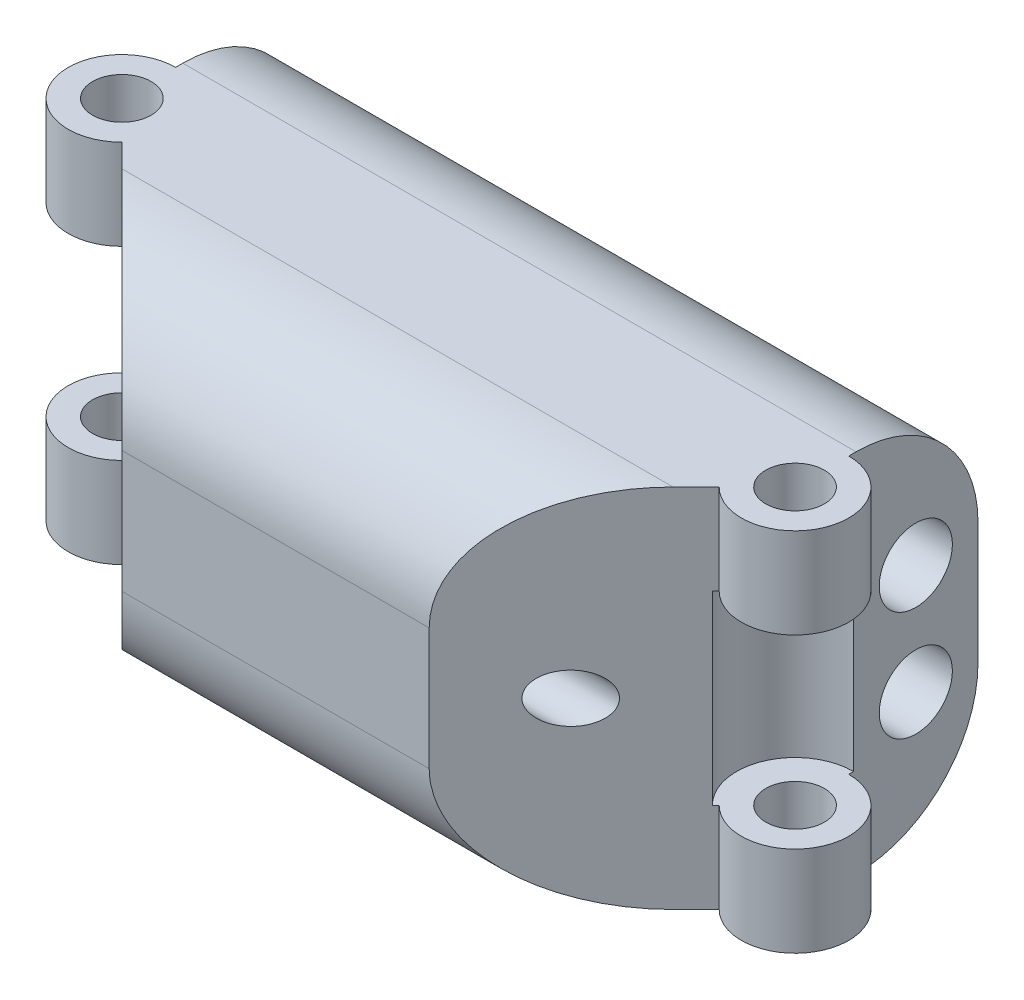
ISO-10303-21;
HEADER;
FILE_DESCRIPTION(('STEP AP214'),'2;1');
FILE_NAME('part.step','',(''),(''),'','','');
FILE_SCHEMA(('AUTOMOTIVE_DESIGN { 1 0 10303 214 1 1 1 1 }'));
ENDSEC;
DATA;
#1=APPLICATION_CONTEXT('core data for automotive mechanical design processes');
#2=APPLICATION_PROTOCOL_DEFINITION('international standard','automotive_design',2000,#1);
#3=PRODUCT_CONTEXT('',#1,'mechanical');
#4=PRODUCT('Part','Part','',(#3));
#5=PRODUCT_RELATED_PRODUCT_CATEGORY('part','',(#4));
#6=PRODUCT_DEFINITION_FORMATION('','',#4);
#7=PRODUCT_DEFINITION_CONTEXT('part definition',#1,'design');
#8=PRODUCT_DEFINITION('design','',#6,#7);
#9=PRODUCT_DEFINITION_SHAPE('','',#8);
#10=(LENGTH_UNIT() NAMED_UNIT(*) SI_UNIT(.MILLI.,.METRE.));
#11=(NAMED_UNIT(*) PLANE_ANGLE_UNIT() SI_UNIT($,.RADIAN.));
#12=(NAMED_UNIT(*) SI_UNIT($,.STERADIAN.) SOLID_ANGLE_UNIT());
#13=UNCERTAINTY_MEASURE_WITH_UNIT(LENGTH_MEASURE(1.E-05),#10,'distance_accuracy_value','');
#14=(GEOMETRIC_REPRESENTATION_CONTEXT(3) GLOBAL_UNCERTAINTY_ASSIGNED_CONTEXT((#13)) GLOBAL_UNIT_ASSIGNED_CONTEXT((#10,
#11,#12)) REPRESENTATION_CONTEXT('',''));
#15=CARTESIAN_POINT('',(0.,0.,0.));
#16=DIRECTION('',(0.,0.,1.));
#17=DIRECTION('',(1.,0.,0.));
#18=AXIS2_PLACEMENT_3D('',#15,#16,#17);
#19=CARTESIAN_POINT('',(-13.8,-7.5,0.));
#20=DIRECTION('',(0.,1.,0.));
#21=DIRECTION('',(0.,0.,1.));
#22=AXIS2_PLACEMENT_3D('',#19,#20,#21);
#23=CYLINDRICAL_SURFACE('',#22,2.4);
#24=CARTESIAN_POINT('',(-13.8,-3.8,0.));
#25=DIRECTION('',(0.,1.,0.));
#26=DIRECTION('',(0.,0.,-1.));
#27=AXIS2_PLACEMENT_3D('',#24,#25,#26);
#28=CIRCLE('',#27,2.4);
#29=CARTESIAN_POINT('',(-12.1029437251523,-3.8,1.69705627484772));
#30=VERTEX_POINT('',#29);
#31=CARTESIAN_POINT('',(-13.8,-3.8,-2.39999999999999));
#32=VERTEX_POINT('',#31);
#33=EDGE_CURVE('E226',#30,#32,#28,.T.);
#34=ORIENTED_EDGE('',*,*,#33,.F.);
#35=DIRECTION('',(0.,1.,0.));
#36=VECTOR('',#35,1.);
#37=CARTESIAN_POINT('',(-12.1029437251523,-7.5,1.69705627484771));
#38=LINE('',#37,#36);
#39=CARTESIAN_POINT('',(-12.1029437251523,3.8,1.69705627484771));
#40=VERTEX_POINT('',#39);
#41=EDGE_CURVE('E71',#30,#40,#38,.T.);
#42=ORIENTED_EDGE('',*,*,#41,.T.);
#43=CARTESIAN_POINT('',(-13.8,3.8,0.));
#44=DIRECTION('',(0.,1.,0.));
#45=DIRECTION('',(0.,0.,-1.));
#46=AXIS2_PLACEMENT_3D('',#43,#44,#45);
#47=CIRCLE('',#46,2.4);
#48=CARTESIAN_POINT('',(-13.8,3.8,-2.4));
#49=VERTEX_POINT('',#48);
#50=EDGE_CURVE('E276',#40,#49,#47,.T.);
#51=ORIENTED_EDGE('',*,*,#50,.T.);
#52=DIRECTION('',(0.,1.,0.));
#53=VECTOR('',#52,1.);
#54=CARTESIAN_POINT('',(-13.8,-7.5,-2.4));
#55=LINE('',#54,#53);
#56=EDGE_CURVE('E395',#32,#49,#55,.T.);
#57=ORIENTED_EDGE('',*,*,#56,.F.);
#58=EDGE_LOOP('',(#34,#42,#51,#57));
#59=FACE_BOUND('',#58,.T.);
#60=ADVANCED_FACE('F47',(#59),#23,.F.);
#61=CARTESIAN_POINT('',(13.8,-7.5,0.));
#62=DIRECTION('',(0.,1.,0.));
#63=DIRECTION('',(0.,0.,1.));
#64=AXIS2_PLACEMENT_3D('',#61,#62,#63);
#65=CYLINDRICAL_SURFACE('',#64,2.4);
#66=DIRECTION('',(0.,1.,0.));
#67=VECTOR('',#66,1.);
#68=CARTESIAN_POINT('',(12.1029437251523,-7.5,1.69705627484771));
#69=LINE('',#68,#67);
#70=CARTESIAN_POINT('',(12.1029437251523,-3.8,1.69705627484771));
#71=VERTEX_POINT('',#70);
#72=CARTESIAN_POINT('',(12.1029437251523,3.8,1.69705627484771));
#73=VERTEX_POINT('',#72);
#74=EDGE_CURVE('E63',#71,#73,#69,.T.);
#75=ORIENTED_EDGE('',*,*,#74,.F.);
#76=CARTESIAN_POINT('',(13.8,-3.8,0.));
#77=DIRECTION('',(0.,1.,0.));
#78=DIRECTION('',(0.,0.,1.));
#79=AXIS2_PLACEMENT_3D('',#76,#77,#78);
#80=CIRCLE('',#79,2.4);
#81=CARTESIAN_POINT('',(13.8,-3.8,-2.4));
#82=VERTEX_POINT('',#81);
#83=EDGE_CURVE('E243',#82,#71,#80,.T.);
#84=ORIENTED_EDGE('',*,*,#83,.F.);
#85=DIRECTION('',(0.,1.,0.));
#86=VECTOR('',#85,1.);
#87=CARTESIAN_POINT('',(13.8,-7.5,-2.4));
#88=LINE('',#87,#86);
#89=CARTESIAN_POINT('',(13.8,3.8,-2.4));
#90=VERTEX_POINT('',#89);
#91=EDGE_CURVE('E381',#82,#90,#88,.T.);
#92=ORIENTED_EDGE('',*,*,#91,.T.);
#93=CARTESIAN_POINT('',(13.8,3.8,0.));
#94=DIRECTION('',(0.,1.,0.));
#95=DIRECTION('',(0.,0.,1.));
#96=AXIS2_PLACEMENT_3D('',#93,#94,#95);
#97=CIRCLE('',#96,2.4);
#98=EDGE_CURVE('E324',#90,#73,#97,.T.);
#99=ORIENTED_EDGE('',*,*,#98,.T.);
#100=EDGE_LOOP('',(#75,#84,#92,#99));
#101=FACE_BOUND('',#100,.T.);
#102=ADVANCED_FACE('F500',(#101),#65,.F.);
#103=CARTESIAN_POINT('',(6.9,-7.5,6.9));
#104=DIRECTION('',(-0.707106781186547,0.,-0.707106781186548));
#105=DIRECTION('',(-0.707106781186548,0.,0.707106781186547));
#106=AXIS2_PLACEMENT_3D('',#103,#104,#105);
#107=PLANE('',#106);
#108=CARTESIAN_POINT('',(9.20147186257615,0.,4.59852813742385));
#109=DIRECTION('',(-0.707106781186547,0.,-0.707106781186548));
#110=DIRECTION('',(-0.707106781186548,0.,0.707106781186547));
#111=AXIS2_PLACEMENT_3D('',#108,#109,#110);
#112=ELLIPSE('',#111,1.4142135623731,1.);
#113=CARTESIAN_POINT('',(8.20147186257614,0.,5.59852813742385));
#114=VERTEX_POINT('',#113);
#115=EDGE_CURVE('E340',#114,#114,#112,.T.);
#116=ORIENTED_EDGE('',*,*,#115,.T.);
#117=EDGE_LOOP('',(#116));
#118=FACE_BOUND('',#117,.T.);
#119=DIRECTION('',(-0.707106781186548,0.,0.707106781186547));
#120=VECTOR('',#119,1.);
#121=CARTESIAN_POINT('',(6.9,7.5,6.9));
#122=LINE('',#121,#120);
#123=CARTESIAN_POINT('',(12.2443650813896,7.5,1.5556349186104));
#124=VERTEX_POINT('',#123);
#125=CARTESIAN_POINT('',(11.3,7.5,2.5));
#126=VERTEX_POINT('',#125);
#127=EDGE_CURVE('E370',#124,#126,#122,.T.);
#128=ORIENTED_EDGE('',*,*,#127,.T.);
#129=CARTESIAN_POINT('',(11.3,2.5,2.5));
#130=DIRECTION('',(-0.707106781186547,0.,-0.707106781186548));
#131=DIRECTION('',(0.707106781186548,0.,-0.707106781186547));
#132=AXIS2_PLACEMENT_3D('',#129,#130,#131);
#133=ELLIPSE('',#132,7.07106781186548,5.);
#134=CARTESIAN_POINT('',(6.3,2.5,7.5));
#135=VERTEX_POINT('',#134);
#136=EDGE_CURVE('E56',#126,#135,#133,.F.);
#137=ORIENTED_EDGE('',*,*,#136,.T.);
#138=DIRECTION('',(0.,1.,0.));
#139=VECTOR('',#138,1.);
#140=CARTESIAN_POINT('',(6.3,-7.5,7.5));
#141=LINE('',#140,#139);
#142=CARTESIAN_POINT('',(6.3,-2.5,7.5));
#143=VERTEX_POINT('',#142);
#144=EDGE_CURVE('E385',#143,#135,#141,.T.);
#145=ORIENTED_EDGE('',*,*,#144,.F.);
#146=CARTESIAN_POINT('',(11.3,-2.5,2.5));
#147=DIRECTION('',(-0.707106781186547,0.,-0.707106781186548));
#148=DIRECTION('',(-0.707106781186548,0.,0.707106781186547));
#149=AXIS2_PLACEMENT_3D('',#146,#147,#148);
#150=ELLIPSE('',#149,7.07106781186548,5.);
#151=CARTESIAN_POINT('',(11.3,-7.5,2.5));
#152=VERTEX_POINT('',#151);
#153=EDGE_CURVE('E447',#143,#152,#150,.F.);
#154=ORIENTED_EDGE('',*,*,#153,.T.);
#155=DIRECTION('',(-0.707106781186548,0.,0.707106781186547));
#156=VECTOR('',#155,1.);
#157=CARTESIAN_POINT('',(6.9,-7.5,6.9));
#158=LINE('',#157,#156);
#159=CARTESIAN_POINT('',(12.2443650813896,-7.5,1.5556349186104));
#160=VERTEX_POINT('',#159);
#161=EDGE_CURVE('E378',#160,#152,#158,.T.);
#162=ORIENTED_EDGE('',*,*,#161,.F.);
#163=DIRECTION('',(0.,1.,0.));
#164=VECTOR('',#163,1.);
#165=CARTESIAN_POINT('',(12.2443650813896,-7.5,1.5556349186104));
#166=LINE('',#165,#164);
#167=CARTESIAN_POINT('',(12.2443650813896,-3.8,1.5556349186104));
#168=VERTEX_POINT('',#167);
#169=EDGE_CURVE('E252',#160,#168,#166,.T.);
#170=ORIENTED_EDGE('',*,*,#169,.T.);
#171=DIRECTION('',(0.707106781186548,0.,-0.707106781186546));
#172=VECTOR('',#171,1.);
#173=CARTESIAN_POINT('',(12.1029437251523,-3.8,1.69705627484771));
#174=LINE('',#173,#172);
#175=EDGE_CURVE('E257',#71,#168,#174,.T.);
#176=ORIENTED_EDGE('',*,*,#175,.F.);
#177=ORIENTED_EDGE('',*,*,#74,.T.);
#178=DIRECTION('',(0.707106781186548,0.,-0.707106781186546));
#179=VECTOR('',#178,1.);
#180=CARTESIAN_POINT('',(12.1029437251523,3.8,1.69705627484771));
#181=LINE('',#180,#179);
#182=CARTESIAN_POINT('',(12.2443650813896,3.8,1.5556349186104));
#183=VERTEX_POINT('',#182);
#184=EDGE_CURVE('E321',#73,#183,#181,.T.);
#185=ORIENTED_EDGE('',*,*,#184,.T.);
#186=DIRECTION('',(0.,-1.,0.));
#187=VECTOR('',#186,1.);
#188=CARTESIAN_POINT('',(12.2443650813896,7.5,1.5556349186104));
#189=LINE('',#188,#187);
#190=EDGE_CURVE('E237',#124,#183,#189,.T.);
#191=ORIENTED_EDGE('',*,*,#190,.F.);
#192=EDGE_LOOP('',(#128,#137,#145,#154,#162,#170,#176,#177,#185,#191));
#193=FACE_BOUND('',#192,.T.);
#194=ADVANCED_FACE('F452',(#118,#193),#107,.F.);
#195=CARTESIAN_POINT('',(0.,-7.5,7.5));
#196=DIRECTION('',(0.,0.,-1.));
#197=DIRECTION('',(-1.,0.,0.));
#198=AXIS2_PLACEMENT_3D('',#195,#196,#197);
#199=PLANE('',#198);
#200=ORIENTED_EDGE('',*,*,#144,.T.);
#201=DIRECTION('',(-1.,0.,0.));
#202=VECTOR('',#201,1.);
#203=CARTESIAN_POINT('',(-6.3,2.5,7.5));
#204=LINE('',#203,#202);
#205=CARTESIAN_POINT('',(-6.3,2.5,7.5));
#206=VERTEX_POINT('',#205);
#207=EDGE_CURVE('E434',#135,#206,#204,.T.);
#208=ORIENTED_EDGE('',*,*,#207,.T.);
#209=DIRECTION('',(0.,1.,0.));
#210=VECTOR('',#209,1.);
#211=CARTESIAN_POINT('',(-6.3,-7.5,7.5));
#212=LINE('',#211,#210);
#213=CARTESIAN_POINT('',(-6.3,-2.5,7.5));
#214=VERTEX_POINT('',#213);
#215=EDGE_CURVE('E389',#214,#206,#212,.T.);
#216=ORIENTED_EDGE('',*,*,#215,.F.);
#217=DIRECTION('',(-1.,0.,0.));
#218=VECTOR('',#217,1.);
#219=CARTESIAN_POINT('',(0.,-2.5,7.5));
#220=LINE('',#219,#218);
#221=EDGE_CURVE('E431',#214,#143,#220,.F.);
#222=ORIENTED_EDGE('',*,*,#221,.T.);
#223=EDGE_LOOP('',(#200,#208,#216,#222));
#224=FACE_BOUND('',#223,.T.);
#225=ADVANCED_FACE('F459',(#224),#199,.F.);
#226=CARTESIAN_POINT('',(-6.9,-7.5,6.9));
#227=DIRECTION('',(0.707106781186547,0.,-0.707106781186548));
#228=DIRECTION('',(-0.707106781186548,0.,-0.707106781186547));
#229=AXIS2_PLACEMENT_3D('',#226,#227,#228);
#230=PLANE('',#229);
#231=CARTESIAN_POINT('',(-9.20147186257615,0.,4.59852813742385));
#232=DIRECTION('',(0.707106781186547,0.,-0.707106781186548));
#233=DIRECTION('',(0.707106781186548,0.,0.707106781186547));
#234=AXIS2_PLACEMENT_3D('',#231,#232,#233);
#235=ELLIPSE('',#234,1.4142135623731,1.);
#236=CARTESIAN_POINT('',(-8.20147186257614,0.,5.59852813742385));
#237=VERTEX_POINT('',#236);
#238=EDGE_CURVE('E305',#237,#237,#235,.F.);
#239=ORIENTED_EDGE('',*,*,#238,.F.);
#240=EDGE_LOOP('',(#239));
#241=FACE_BOUND('',#240,.T.);
#242=ORIENTED_EDGE('',*,*,#215,.T.);
#243=CARTESIAN_POINT('',(-11.3,2.5,2.5));
#244=DIRECTION('',(0.707106781186547,0.,-0.707106781186548));
#245=DIRECTION('',(0.707106781186548,0.,0.707106781186547));
#246=AXIS2_PLACEMENT_3D('',#243,#244,#245);
#247=ELLIPSE('',#246,7.07106781186548,5.);
#248=CARTESIAN_POINT('',(-11.3,7.5,2.5));
#249=VERTEX_POINT('',#248);
#250=EDGE_CURVE('E441',#206,#249,#247,.F.);
#251=ORIENTED_EDGE('',*,*,#250,.T.);
#252=DIRECTION('',(-0.707106781186548,0.,-0.707106781186547));
#253=VECTOR('',#252,1.);
#254=CARTESIAN_POINT('',(-6.9,7.5,6.9));
#255=LINE('',#254,#253);
#256=CARTESIAN_POINT('',(-12.2443650813896,7.5,1.55563491861041));
#257=VERTEX_POINT('',#256);
#258=EDGE_CURVE('E367',#249,#257,#255,.T.);
#259=ORIENTED_EDGE('',*,*,#258,.T.);
#260=DIRECTION('',(0.,-1.,0.));
#261=VECTOR('',#260,1.);
#262=CARTESIAN_POINT('',(-12.2443650813896,7.5,1.55563491861041));
#263=LINE('',#262,#261);
#264=CARTESIAN_POINT('',(-12.2443650813896,3.8,1.55563491861041));
#265=VERTEX_POINT('',#264);
#266=EDGE_CURVE('E286',#257,#265,#263,.T.);
#267=ORIENTED_EDGE('',*,*,#266,.T.);
#268=DIRECTION('',(0.707106781186548,0.,0.707106781186546));
#269=VECTOR('',#268,1.);
#270=CARTESIAN_POINT('',(-12.1029437251523,3.8,1.69705627484772));
#271=LINE('',#270,#269);
#272=EDGE_CURVE('E287',#265,#40,#271,.T.);
#273=ORIENTED_EDGE('',*,*,#272,.T.);
#274=ORIENTED_EDGE('',*,*,#41,.F.);
#275=DIRECTION('',(0.707106781186548,0.,0.707106781186546));
#276=VECTOR('',#275,1.);
#277=CARTESIAN_POINT('',(-12.1029437251523,-3.8,1.69705627484772));
#278=LINE('',#277,#276);
#279=CARTESIAN_POINT('',(-12.2443650813896,-3.8,1.55563491861041));
#280=VERTEX_POINT('',#279);
#281=EDGE_CURVE('E218',#280,#30,#278,.T.);
#282=ORIENTED_EDGE('',*,*,#281,.F.);
#283=DIRECTION('',(0.,1.,0.));
#284=VECTOR('',#283,1.);
#285=CARTESIAN_POINT('',(-12.2443650813896,-7.5,1.55563491861041));
#286=LINE('',#285,#284);
#287=CARTESIAN_POINT('',(-12.2443650813896,-7.5,1.55563491861041));
#288=VERTEX_POINT('',#287);
#289=EDGE_CURVE('E210',#288,#280,#286,.T.);
#290=ORIENTED_EDGE('',*,*,#289,.F.);
#291=DIRECTION('',(-0.707106781186548,0.,-0.707106781186547));
#292=VECTOR('',#291,1.);
#293=CARTESIAN_POINT('',(-6.9,-7.5,6.9));
#294=LINE('',#293,#292);
#295=CARTESIAN_POINT('',(-11.3,-7.5,2.5));
#296=VERTEX_POINT('',#295);
#297=EDGE_CURVE('E199',#296,#288,#294,.T.);
#298=ORIENTED_EDGE('',*,*,#297,.F.);
#299=CARTESIAN_POINT('',(-11.3,-2.5,2.5));
#300=DIRECTION('',(0.707106781186547,0.,-0.707106781186548));
#301=DIRECTION('',(-0.707106781186548,0.,-0.707106781186547));
#302=AXIS2_PLACEMENT_3D('',#299,#300,#301);
#303=ELLIPSE('',#302,7.07106781186548,5.);
#304=EDGE_CURVE('E438',#296,#214,#303,.F.);
#305=ORIENTED_EDGE('',*,*,#304,.T.);
#306=EDGE_LOOP('',(#242,#251,#259,#267,#273,#274,#282,#290,#298,#305));
#307=FACE_BOUND('',#306,.T.);
#308=ADVANCED_FACE('F465',(#241,#307),#230,.F.);
#309=CARTESIAN_POINT('',(-13.8,-7.5,0.));
#310=DIRECTION('',(1.,0.,0.));
#311=DIRECTION('',(0.,0.,-1.));
#312=AXIS2_PLACEMENT_3D('',#309,#310,#311);
#313=PLANE('',#312);
#314=CARTESIAN_POINT('',(-13.8,-2.25,-4.95));
#315=DIRECTION('',(1.,0.,0.));
#316=DIRECTION('',(0.,0.,-1.));
#317=AXIS2_PLACEMENT_3D('',#314,#315,#316);
#318=CIRCLE('',#317,1.5);
#319=CARTESIAN_POINT('',(-13.8,-2.25,-6.45));
#320=VERTEX_POINT('',#319);
#321=EDGE_CURVE('E349',#320,#320,#318,.F.);
#322=ORIENTED_EDGE('',*,*,#321,.F.);
#323=EDGE_LOOP('',(#322));
#324=FACE_BOUND('',#323,.T.);
#325=CARTESIAN_POINT('',(-13.8,2.25,-4.95));
#326=DIRECTION('',(1.,0.,0.));
#327=DIRECTION('',(0.,0.,-1.));
#328=AXIS2_PLACEMENT_3D('',#325,#326,#327);
#329=CIRCLE('',#328,1.5);
#330=CARTESIAN_POINT('',(-13.8,2.25,-6.45));
#331=VERTEX_POINT('',#330);
#332=EDGE_CURVE('E350',#331,#331,#329,.F.);
#333=ORIENTED_EDGE('',*,*,#332,.F.);
#334=EDGE_LOOP('',(#333));
#335=FACE_BOUND('',#334,.T.);
#336=DIRECTION('',(0.,1.,0.));
#337=VECTOR('',#336,1.);
#338=CARTESIAN_POINT('',(-13.8,-7.5,-7.5));
#339=LINE('',#338,#337);
#340=CARTESIAN_POINT('',(-13.8,-2.5,-7.5));
#341=VERTEX_POINT('',#340);
#342=CARTESIAN_POINT('',(-13.8,2.5,-7.5));
#343=VERTEX_POINT('',#342);
#344=EDGE_CURVE('E398',#341,#343,#339,.T.);
#345=ORIENTED_EDGE('',*,*,#344,.F.);
#346=CARTESIAN_POINT('',(-13.8,-2.5,-2.5));
#347=DIRECTION('',(1.,0.,0.));
#348=DIRECTION('',(0.,0.,-1.));
#349=AXIS2_PLACEMENT_3D('',#346,#347,#348);
#350=CIRCLE('',#349,5.);
#351=CARTESIAN_POINT('',(-13.8,-7.5,-2.5));
#352=VERTEX_POINT('',#351);
#353=EDGE_CURVE('E193',#341,#352,#350,.F.);
#354=ORIENTED_EDGE('',*,*,#353,.T.);
#355=DIRECTION('',(0.,0.,-1.));
#356=VECTOR('',#355,1.);
#357=CARTESIAN_POINT('',(-13.8,-7.5,0.));
#358=LINE('',#357,#356);
#359=CARTESIAN_POINT('',(-13.8,-7.5,-2.19999999999999));
#360=VERTEX_POINT('',#359);
#361=EDGE_CURVE('E186',#360,#352,#358,.T.);
#362=ORIENTED_EDGE('',*,*,#361,.F.);
#363=DIRECTION('',(0.,1.,0.));
#364=VECTOR('',#363,1.);
#365=CARTESIAN_POINT('',(-13.8,-7.5,-2.19999999999999));
#366=LINE('',#365,#364);
#367=CARTESIAN_POINT('',(-13.8,-3.8,-2.19999999999999));
#368=VERTEX_POINT('',#367);
#369=EDGE_CURVE('E190',#360,#368,#366,.T.);
#370=ORIENTED_EDGE('',*,*,#369,.T.);
#371=DIRECTION('',(0.,0.,1.));
#372=VECTOR('',#371,1.);
#373=CARTESIAN_POINT('',(-13.8,-3.8,-2.39999999999999));
#374=LINE('',#373,#372);
#375=EDGE_CURVE('E230',#32,#368,#374,.T.);
#376=ORIENTED_EDGE('',*,*,#375,.F.);
#377=ORIENTED_EDGE('',*,*,#56,.T.);
#378=DIRECTION('',(0.,0.,1.));
#379=VECTOR('',#378,1.);
#380=CARTESIAN_POINT('',(-13.8,3.8,-2.39999999999999));
#381=LINE('',#380,#379);
#382=CARTESIAN_POINT('',(-13.8,3.8,-2.19999999999999));
#383=VERTEX_POINT('',#382);
#384=EDGE_CURVE('E290',#49,#383,#381,.T.);
#385=ORIENTED_EDGE('',*,*,#384,.T.);
#386=DIRECTION('',(0.,-1.,0.));
#387=VECTOR('',#386,1.);
#388=CARTESIAN_POINT('',(-13.8,7.5,-2.19999999999999));
#389=LINE('',#388,#387);
#390=CARTESIAN_POINT('',(-13.8,7.5,-2.19999999999999));
#391=VERTEX_POINT('',#390);
#392=EDGE_CURVE('E301',#391,#383,#389,.T.);
#393=ORIENTED_EDGE('',*,*,#392,.F.);
#394=DIRECTION('',(0.,0.,-1.));
#395=VECTOR('',#394,1.);
#396=CARTESIAN_POINT('',(-13.8,7.5,0.));
#397=LINE('',#396,#395);
#398=CARTESIAN_POINT('',(-13.8,7.5,-2.5));
#399=VERTEX_POINT('',#398);
#400=EDGE_CURVE('E363',#391,#399,#397,.T.);
#401=ORIENTED_EDGE('',*,*,#400,.T.);
#402=CARTESIAN_POINT('',(-13.8,2.5,-2.5));
#403=DIRECTION('',(1.,0.,0.));
#404=DIRECTION('',(0.,0.,-1.));
#405=AXIS2_PLACEMENT_3D('',#402,#403,#404);
#406=CIRCLE('',#405,5.);
#407=EDGE_CURVE('E423',#399,#343,#406,.F.);
#408=ORIENTED_EDGE('',*,*,#407,.T.);
#409=EDGE_LOOP('',(#345,#354,#362,#370,#376,#377,#385,#393,#401,#408));
#410=FACE_BOUND('',#409,.T.);
#411=ADVANCED_FACE('F189',(#324,#335,#410),#313,.F.);
#412=CARTESIAN_POINT('',(0.,-7.5,-7.5));
#413=DIRECTION('',(0.,0.,1.));
#414=DIRECTION('',(1.,0.,0.));
#415=AXIS2_PLACEMENT_3D('',#412,#413,#414);
#416=PLANE('',#415);
#417=DIRECTION('',(0.,1.,0.));
#418=VECTOR('',#417,1.);
#419=CARTESIAN_POINT('',(13.8,-7.5,-7.5));
#420=LINE('',#419,#418);
#421=CARTESIAN_POINT('',(13.8,-2.5,-7.5));
#422=VERTEX_POINT('',#421);
#423=CARTESIAN_POINT('',(13.8,2.5,-7.5));
#424=VERTEX_POINT('',#423);
#425=EDGE_CURVE('E402',#422,#424,#420,.T.);
#426=ORIENTED_EDGE('',*,*,#425,.F.);
#427=DIRECTION('',(1.,0.,0.));
#428=VECTOR('',#427,1.);
#429=CARTESIAN_POINT('',(0.,-2.5,-7.5));
#430=LINE('',#429,#428);
#431=EDGE_CURVE('E420',#422,#341,#430,.F.);
#432=ORIENTED_EDGE('',*,*,#431,.T.);
#433=ORIENTED_EDGE('',*,*,#344,.T.);
#434=DIRECTION('',(1.,0.,0.));
#435=VECTOR('',#434,1.);
#436=CARTESIAN_POINT('',(13.8,2.5,-7.5));
#437=LINE('',#436,#435);
#438=EDGE_CURVE('E416',#343,#424,#437,.T.);
#439=ORIENTED_EDGE('',*,*,#438,.T.);
#440=EDGE_LOOP('',(#426,#432,#433,#439));
#441=FACE_BOUND('',#440,.T.);
#442=ADVANCED_FACE('F521',(#441),#416,.F.);
#443=CARTESIAN_POINT('',(13.8,-7.5,0.));
#444=DIRECTION('',(-1.,0.,0.));
#445=DIRECTION('',(0.,0.,1.));
#446=AXIS2_PLACEMENT_3D('',#443,#444,#445);
#447=PLANE('',#446);
#448=CARTESIAN_POINT('',(13.8,-2.25,-4.95));
#449=DIRECTION('',(1.,0.,0.));
#450=DIRECTION('',(0.,0.,-1.));
#451=AXIS2_PLACEMENT_3D('',#448,#449,#450);
#452=CIRCLE('',#451,1.5);
#453=CARTESIAN_POINT('',(13.8,-2.25,-6.45));
#454=VERTEX_POINT('',#453);
#455=EDGE_CURVE('E345',#454,#454,#452,.T.);
#456=ORIENTED_EDGE('',*,*,#455,.F.);
#457=EDGE_LOOP('',(#456));
#458=FACE_BOUND('',#457,.T.);
#459=CARTESIAN_POINT('',(13.8,2.25,-4.95));
#460=DIRECTION('',(1.,0.,0.));
#461=DIRECTION('',(0.,0.,-1.));
#462=AXIS2_PLACEMENT_3D('',#459,#460,#461);
#463=CIRCLE('',#462,1.5);
#464=CARTESIAN_POINT('',(13.8,2.25,-6.45));
#465=VERTEX_POINT('',#464);
#466=EDGE_CURVE('E344',#465,#465,#463,.T.);
#467=ORIENTED_EDGE('',*,*,#466,.F.);
#468=EDGE_LOOP('',(#467));
#469=FACE_BOUND('',#468,.T.);
#470=DIRECTION('',(0.,0.,1.));
#471=VECTOR('',#470,1.);
#472=CARTESIAN_POINT('',(13.8,-7.5,0.));
#473=LINE('',#472,#471);
#474=CARTESIAN_POINT('',(13.8,-7.5,-2.5));
#475=VERTEX_POINT('',#474);
#476=CARTESIAN_POINT('',(13.8,-7.5,-2.2));
#477=VERTEX_POINT('',#476);
#478=EDGE_CURVE('E200',#475,#477,#473,.T.);
#479=ORIENTED_EDGE('',*,*,#478,.F.);
#480=CARTESIAN_POINT('',(13.8,-2.5,-2.5));
#481=DIRECTION('',(-1.,0.,0.));
#482=DIRECTION('',(0.,0.,1.));
#483=AXIS2_PLACEMENT_3D('',#480,#481,#482);
#484=CIRCLE('',#483,5.);
#485=EDGE_CURVE('E413',#475,#422,#484,.F.);
#486=ORIENTED_EDGE('',*,*,#485,.T.);
#487=ORIENTED_EDGE('',*,*,#425,.T.);
#488=CARTESIAN_POINT('',(13.8,2.5,-2.5));
#489=DIRECTION('',(-1.,0.,0.));
#490=DIRECTION('',(0.,0.,1.));
#491=AXIS2_PLACEMENT_3D('',#488,#489,#490);
#492=CIRCLE('',#491,5.);
#493=CARTESIAN_POINT('',(13.8,7.5,-2.5));
#494=VERTEX_POINT('',#493);
#495=EDGE_CURVE('E410',#424,#494,#492,.F.);
#496=ORIENTED_EDGE('',*,*,#495,.T.);
#497=DIRECTION('',(0.,0.,1.));
#498=VECTOR('',#497,1.);
#499=CARTESIAN_POINT('',(13.8,7.5,0.));
#500=LINE('',#499,#498);
#501=CARTESIAN_POINT('',(13.8,7.5,-2.2));
#502=VERTEX_POINT('',#501);
#503=EDGE_CURVE('E354',#494,#502,#500,.T.);
#504=ORIENTED_EDGE('',*,*,#503,.T.);
#505=DIRECTION('',(0.,-1.,0.));
#506=VECTOR('',#505,1.);
#507=CARTESIAN_POINT('',(13.8,7.5,-2.2));
#508=LINE('',#507,#506);
#509=CARTESIAN_POINT('',(13.8,3.8,-2.2));
#510=VERTEX_POINT('',#509);
#511=EDGE_CURVE('E309',#502,#510,#508,.T.);
#512=ORIENTED_EDGE('',*,*,#511,.T.);
#513=DIRECTION('',(0.,0.,-1.));
#514=VECTOR('',#513,1.);
#515=CARTESIAN_POINT('',(13.8,3.8,-2.4));
#516=LINE('',#515,#514);
#517=EDGE_CURVE('E314',#510,#90,#516,.T.);
#518=ORIENTED_EDGE('',*,*,#517,.T.);
#519=ORIENTED_EDGE('',*,*,#91,.F.);
#520=DIRECTION('',(0.,0.,-1.));
#521=VECTOR('',#520,1.);
#522=CARTESIAN_POINT('',(13.8,-3.8,-2.4));
#523=LINE('',#522,#521);
#524=CARTESIAN_POINT('',(13.8,-3.8,-2.2));
#525=VERTEX_POINT('',#524);
#526=EDGE_CURVE('E253',#525,#82,#523,.T.);
#527=ORIENTED_EDGE('',*,*,#526,.F.);
#528=DIRECTION('',(0.,1.,0.));
#529=VECTOR('',#528,1.);
#530=CARTESIAN_POINT('',(13.8,-7.5,-2.2));
#531=LINE('',#530,#529);
#532=EDGE_CURVE('E267',#477,#525,#531,.T.);
#533=ORIENTED_EDGE('',*,*,#532,.F.);
#534=EDGE_LOOP('',(#479,#486,#487,#496,#504,#512,#518,#519,#527,#533));
#535=FACE_BOUND('',#534,.T.);
#536=ADVANCED_FACE('F525',(#458,#469,#535),#447,.F.);
#537=CARTESIAN_POINT('',(0.,-7.5,0.));
#538=DIRECTION('',(0.,1.,0.));
#539=DIRECTION('',(0.,0.,1.));
#540=AXIS2_PLACEMENT_3D('',#537,#538,#539);
#541=PLANE('',#540);
#542=ORIENTED_EDGE('',*,*,#161,.T.);
#543=DIRECTION('',(-1.,0.,0.));
#544=VECTOR('',#543,1.);
#545=CARTESIAN_POINT('',(0.,-7.5,2.5));
#546=LINE('',#545,#544);
#547=EDGE_CURVE('E11',#152,#296,#546,.T.);
#548=ORIENTED_EDGE('',*,*,#547,.T.);
#549=ORIENTED_EDGE('',*,*,#297,.T.);
#550=CARTESIAN_POINT('',(-13.8,-7.5,0.));
#551=DIRECTION('',(0.,1.,0.));
#552=DIRECTION('',(0.,0.,-1.));
#553=AXIS2_PLACEMENT_3D('',#550,#551,#552);
#554=CIRCLE('',#553,2.2);
#555=EDGE_CURVE('E205',#360,#288,#554,.T.);
#556=ORIENTED_EDGE('',*,*,#555,.F.);
#557=ORIENTED_EDGE('',*,*,#361,.T.);
#558=DIRECTION('',(1.,0.,0.));
#559=VECTOR('',#558,1.);
#560=CARTESIAN_POINT('',(0.,-7.5,-2.5));
#561=LINE('',#560,#559);
#562=EDGE_CURVE('E384',#352,#475,#561,.T.);
#563=ORIENTED_EDGE('',*,*,#562,.T.);
#564=ORIENTED_EDGE('',*,*,#478,.T.);
#565=CARTESIAN_POINT('',(13.8,-7.5,0.));
#566=DIRECTION('',(0.,1.,0.));
#567=DIRECTION('',(0.,0.,1.));
#568=AXIS2_PLACEMENT_3D('',#565,#566,#567);
#569=CIRCLE('',#568,2.2);
#570=EDGE_CURVE('E248',#160,#477,#569,.T.);
#571=ORIENTED_EDGE('',*,*,#570,.F.);
#572=EDGE_LOOP('',(#542,#548,#549,#556,#557,#563,#564,#571));
#573=FACE_BOUND('',#572,.T.);
#574=CARTESIAN_POINT('',(13.8,-7.5,0.));
#575=DIRECTION('',(0.,1.,0.));
#576=DIRECTION('',(0.,0.,1.));
#577=AXIS2_PLACEMENT_3D('',#574,#575,#576);
#578=CIRCLE('',#577,1.2);
#579=CARTESIAN_POINT('',(13.8,-7.5,1.2));
#580=VERTEX_POINT('',#579);
#581=EDGE_CURVE('E239',#580,#580,#578,.T.);
#582=ORIENTED_EDGE('',*,*,#581,.T.);
#583=EDGE_LOOP('',(#582));
#584=FACE_BOUND('',#583,.T.);
#585=CARTESIAN_POINT('',(-13.8,-7.5,0.));
#586=DIRECTION('',(0.,1.,0.));
#587=DIRECTION('',(0.,0.,-1.));
#588=AXIS2_PLACEMENT_3D('',#585,#586,#587);
#589=CIRCLE('',#588,1.2);
#590=CARTESIAN_POINT('',(-13.8,-7.5,-1.19999999999999));
#591=VERTEX_POINT('',#590);
#592=EDGE_CURVE('E231',#591,#591,#589,.T.);
#593=ORIENTED_EDGE('',*,*,#592,.T.);
#594=EDGE_LOOP('',(#593));
#595=FACE_BOUND('',#594,.T.);
#596=ADVANCED_FACE('F213',(#573,#584,#595),#541,.F.);
#597=CARTESIAN_POINT('',(0.,7.5,0.));
#598=DIRECTION('',(0.,1.,0.));
#599=DIRECTION('',(0.,0.,1.));
#600=AXIS2_PLACEMENT_3D('',#597,#598,#599);
#601=PLANE('',#600);
#602=ORIENTED_EDGE('',*,*,#258,.F.);
#603=DIRECTION('',(-1.,0.,0.));
#604=VECTOR('',#603,1.);
#605=CARTESIAN_POINT('',(6.3,7.5,2.5));
#606=LINE('',#605,#604);
#607=EDGE_CURVE('E444',#249,#126,#606,.F.);
#608=ORIENTED_EDGE('',*,*,#607,.T.);
#609=ORIENTED_EDGE('',*,*,#127,.F.);
#610=CARTESIAN_POINT('',(13.8,7.5,0.));
#611=DIRECTION('',(0.,1.,0.));
#612=DIRECTION('',(0.,0.,1.));
#613=AXIS2_PLACEMENT_3D('',#610,#611,#612);
#614=CIRCLE('',#613,2.2);
#615=EDGE_CURVE('E313',#124,#502,#614,.T.);
#616=ORIENTED_EDGE('',*,*,#615,.T.);
#617=ORIENTED_EDGE('',*,*,#503,.F.);
#618=DIRECTION('',(1.,0.,0.));
#619=VECTOR('',#618,1.);
#620=CARTESIAN_POINT('',(-13.8,7.5,-2.5));
#621=LINE('',#620,#619);
#622=EDGE_CURVE('E428',#494,#399,#621,.F.);
#623=ORIENTED_EDGE('',*,*,#622,.T.);
#624=ORIENTED_EDGE('',*,*,#400,.F.);
#625=CARTESIAN_POINT('',(-13.8,7.5,0.));
#626=DIRECTION('',(0.,1.,0.));
#627=DIRECTION('',(0.,0.,-1.));
#628=AXIS2_PLACEMENT_3D('',#625,#626,#627);
#629=CIRCLE('',#628,2.2);
#630=EDGE_CURVE('E282',#391,#257,#629,.T.);
#631=ORIENTED_EDGE('',*,*,#630,.T.);
#632=EDGE_LOOP('',(#602,#608,#609,#616,#617,#623,#624,#631));
#633=FACE_BOUND('',#632,.T.);
#634=CARTESIAN_POINT('',(13.8,7.5,0.));
#635=DIRECTION('',(0.,1.,0.));
#636=DIRECTION('',(0.,0.,1.));
#637=AXIS2_PLACEMENT_3D('',#634,#635,#636);
#638=CIRCLE('',#637,1.2);
#639=CARTESIAN_POINT('',(13.8,7.5,1.2));
#640=VERTEX_POINT('',#639);
#641=EDGE_CURVE('E327',#640,#640,#638,.T.);
#642=ORIENTED_EDGE('',*,*,#641,.F.);
#643=EDGE_LOOP('',(#642));
#644=FACE_BOUND('',#643,.T.);
#645=CARTESIAN_POINT('',(-13.8,7.5,0.));
#646=DIRECTION('',(0.,1.,0.));
#647=DIRECTION('',(0.,0.,-1.));
#648=AXIS2_PLACEMENT_3D('',#645,#646,#647);
#649=CIRCLE('',#648,1.2);
#650=CARTESIAN_POINT('',(-13.8,7.5,-1.19999999999999));
#651=VERTEX_POINT('',#650);
#652=EDGE_CURVE('E272',#651,#651,#649,.T.);
#653=ORIENTED_EDGE('',*,*,#652,.F.);
#654=EDGE_LOOP('',(#653));
#655=FACE_BOUND('',#654,.T.);
#656=ADVANCED_FACE('F467',(#633,#644,#655),#601,.T.);
#657=CARTESIAN_POINT('',(-13.801,2.25,-4.95));
#658=DIRECTION('',(1.,0.,0.));
#659=DIRECTION('',(0.,0.,-1.));
#660=AXIS2_PLACEMENT_3D('',#657,#658,#659);
#661=CYLINDRICAL_SURFACE('',#660,1.5);
#662=CARTESIAN_POINT('',(13.8,2.25,-6.45));
#663=CARTESIAN_POINT('',(13.5125,2.25,-6.45));
#664=CARTESIAN_POINT('',(13.225,2.25,-6.45));
#665=CARTESIAN_POINT('',(12.65,2.25,-6.45));
#666=CARTESIAN_POINT('',(12.3625,2.25,-6.45));
#667=CARTESIAN_POINT('',(11.7875,2.25,-6.45));
#668=CARTESIAN_POINT('',(11.5,2.25,-6.45));
#669=CARTESIAN_POINT('',(10.925,2.25,-6.45));
#670=CARTESIAN_POINT('',(10.6375,2.25,-6.45));
#671=CARTESIAN_POINT('',(10.0625,2.25,-6.45));
#672=CARTESIAN_POINT('',(9.775,2.25,-6.45));
#673=CARTESIAN_POINT('',(9.2,2.25,-6.45));
#674=CARTESIAN_POINT('',(8.9125,2.25,-6.45));
#675=CARTESIAN_POINT('',(8.3375,2.25,-6.45));
#676=CARTESIAN_POINT('',(8.05,2.25,-6.45));
#677=CARTESIAN_POINT('',(7.475,2.25,-6.45));
#678=CARTESIAN_POINT('',(7.1875,2.25,-6.45));
#679=CARTESIAN_POINT('',(6.6125,2.25,-6.45));
#680=CARTESIAN_POINT('',(6.32499999999999,2.25,-6.45));
#681=CARTESIAN_POINT('',(5.74999999999999,2.25,-6.45));
#682=CARTESIAN_POINT('',(5.4625,2.25,-6.45));
#683=CARTESIAN_POINT('',(4.88749999999999,2.25,-6.45));
#684=CARTESIAN_POINT('',(4.59999999999999,2.25,-6.45));
#685=CARTESIAN_POINT('',(4.02499999999999,2.25,-6.45));
#686=CARTESIAN_POINT('',(3.73749999999999,2.25,-6.45));
#687=CARTESIAN_POINT('',(3.1625,2.25,-6.45));
#688=CARTESIAN_POINT('',(2.875,2.25,-6.45));
#689=CARTESIAN_POINT('',(2.3,2.25,-6.45));
#690=CARTESIAN_POINT('',(2.0125,2.25,-6.45));
#691=CARTESIAN_POINT('',(1.4375,2.25,-6.45));
#692=CARTESIAN_POINT('',(1.15,2.25,-6.45));
#693=CARTESIAN_POINT('',(0.574999999999997,2.25,-6.45));
#694=CARTESIAN_POINT('',(0.287499999999997,2.25,-6.45));
#695=CARTESIAN_POINT('',(-0.287500000000004,2.25,-6.45));
#696=CARTESIAN_POINT('',(-0.575000000000004,2.25,-6.45));
#697=CARTESIAN_POINT('',(-1.15,2.25,-6.45));
#698=CARTESIAN_POINT('',(-1.4375,2.25,-6.45));
#699=CARTESIAN_POINT('',(-2.0125,2.25,-6.45));
#700=CARTESIAN_POINT('',(-2.3,2.25,-6.45));
#701=CARTESIAN_POINT('',(-2.875,2.25,-6.45));
#702=CARTESIAN_POINT('',(-3.1625,2.25,-6.45));
#703=CARTESIAN_POINT('',(-3.7375,2.25,-6.45));
#704=CARTESIAN_POINT('',(-4.025,2.25,-6.45));
#705=CARTESIAN_POINT('',(-4.6,2.25,-6.45));
#706=CARTESIAN_POINT('',(-4.8875,2.25,-6.45));
#707=CARTESIAN_POINT('',(-5.4625,2.25,-6.45));
#708=CARTESIAN_POINT('',(-5.75,2.25,-6.45));
#709=CARTESIAN_POINT('',(-6.325,2.25,-6.45));
#710=CARTESIAN_POINT('',(-6.6125,2.25,-6.45));
#711=CARTESIAN_POINT('',(-7.1875,2.25,-6.45));
#712=CARTESIAN_POINT('',(-7.475,2.25,-6.45));
#713=CARTESIAN_POINT('',(-8.05,2.25,-6.45));
#714=CARTESIAN_POINT('',(-8.3375,2.25,-6.45));
#715=CARTESIAN_POINT('',(-8.9125,2.25,-6.45));
#716=CARTESIAN_POINT('',(-9.2,2.25,-6.45));
#717=CARTESIAN_POINT('',(-9.775,2.25,-6.45));
#718=CARTESIAN_POINT('',(-10.0625,2.25,-6.45));
#719=CARTESIAN_POINT('',(-10.6375,2.25,-6.45));
#720=CARTESIAN_POINT('',(-10.925,2.25,-6.45));
#721=CARTESIAN_POINT('',(-11.5,2.25,-6.45));
#722=CARTESIAN_POINT('',(-11.7875,2.25,-6.45));
#723=CARTESIAN_POINT('',(-12.3625,2.25,-6.45));
#724=CARTESIAN_POINT('',(-12.65,2.25,-6.45));
#725=CARTESIAN_POINT('',(-13.225,2.25,-6.45));
#726=CARTESIAN_POINT('',(-13.5125,2.25,-6.45));
#727=CARTESIAN_POINT('',(-13.8,2.25,-6.45));
#728=B_SPLINE_CURVE_WITH_KNOTS('',3,(#662,#663,#664,#665,#666,#667,#668,#669,#670,#671,#672,
#673,#674,#675,#676,#677,#678,#679,#680,#681,#682,#683,#684,#685,#686,#687,#688,#689,#690,#691,
#692,#693,#694,#695,#696,#697,#698,#699,#700,#701,#702,#703,#704,#705,#706,#707,#708,#709,#710,
#711,#712,#713,#714,#715,#716,#717,#718,#719,#720,#721,#722,#723,#724,#725,#726,#727),
.UNSPECIFIED.,.F.,.F.,(4,2,2,2,2,2,2,2,2,2,2,2,2,2,2,2,2,2,2,2,2,2,2,2,2,2,2,2,2,2,2,2,4),(0.,
0.862499999999999,1.725,2.5875,3.45,4.3125,5.175,6.0375,6.9,7.7625,8.625,9.4875,10.35,11.2125,
12.075,12.9375,13.8,14.6625,15.525,16.3875,17.25,18.1125,18.975,19.8375,20.7,21.5625,22.425,
23.2875,24.15,25.0125,25.875,26.7375,27.6),.UNSPECIFIED.);
#729=EDGE_CURVE('BSEAM557',#465,#331,#728,.T.);
#730=ORIENTED_EDGE('',*,*,#466,.T.);
#731=ORIENTED_EDGE('',*,*,#332,.T.);
#732=ORIENTED_EDGE('',*,*,#729,.T.);
#733=ORIENTED_EDGE('',*,*,#729,.F.);
#734=EDGE_LOOP('',(#730,#732,#731,#733));
#735=FACE_BOUND('',#734,.T.);
#736=ADVANCED_FACE('F557',(#735),#661,.F.);
#737=CARTESIAN_POINT('',(-13.801,-2.25,-4.95));
#738=DIRECTION('',(1.,0.,0.));
#739=DIRECTION('',(0.,0.,-1.));
#740=AXIS2_PLACEMENT_3D('',#737,#738,#739);
#741=CYLINDRICAL_SURFACE('',#740,1.5);
#742=CARTESIAN_POINT('',(13.8,-2.25,-6.45));
#743=CARTESIAN_POINT('',(13.5125,-2.25,-6.45));
#744=CARTESIAN_POINT('',(13.225,-2.25,-6.45));
#745=CARTESIAN_POINT('',(12.65,-2.25,-6.45));
#746=CARTESIAN_POINT('',(12.3625,-2.25,-6.45));
#747=CARTESIAN_POINT('',(11.7875,-2.25,-6.45));
#748=CARTESIAN_POINT('',(11.5,-2.25,-6.45));
#749=CARTESIAN_POINT('',(10.925,-2.25,-6.45));
#750=CARTESIAN_POINT('',(10.6375,-2.25,-6.45));
#751=CARTESIAN_POINT('',(10.0625,-2.25,-6.45));
#752=CARTESIAN_POINT('',(9.775,-2.25,-6.45));
#753=CARTESIAN_POINT('',(9.2,-2.25,-6.45));
#754=CARTESIAN_POINT('',(8.9125,-2.25,-6.45));
#755=CARTESIAN_POINT('',(8.3375,-2.25,-6.45));
#756=CARTESIAN_POINT('',(8.05,-2.25,-6.45));
#757=CARTESIAN_POINT('',(7.475,-2.25,-6.45));
#758=CARTESIAN_POINT('',(7.1875,-2.25,-6.45));
#759=CARTESIAN_POINT('',(6.6125,-2.25,-6.45));
#760=CARTESIAN_POINT('',(6.32499999999999,-2.25,-6.45));
#761=CARTESIAN_POINT('',(5.74999999999999,-2.25,-6.45));
#762=CARTESIAN_POINT('',(5.4625,-2.25,-6.45));
#763=CARTESIAN_POINT('',(4.88749999999999,-2.25,-6.45));
#764=CARTESIAN_POINT('',(4.59999999999999,-2.25,-6.45));
#765=CARTESIAN_POINT('',(4.02499999999999,-2.25,-6.45));
#766=CARTESIAN_POINT('',(3.73749999999999,-2.25,-6.45));
#767=CARTESIAN_POINT('',(3.1625,-2.25,-6.45));
#768=CARTESIAN_POINT('',(2.875,-2.25,-6.45));
#769=CARTESIAN_POINT('',(2.3,-2.25,-6.45));
#770=CARTESIAN_POINT('',(2.0125,-2.25,-6.45));
#771=CARTESIAN_POINT('',(1.4375,-2.25,-6.45));
#772=CARTESIAN_POINT('',(1.15,-2.25,-6.45));
#773=CARTESIAN_POINT('',(0.574999999999997,-2.25,-6.45));
#774=CARTESIAN_POINT('',(0.287499999999997,-2.25,-6.45));
#775=CARTESIAN_POINT('',(-0.287500000000004,-2.25,-6.45));
#776=CARTESIAN_POINT('',(-0.575000000000004,-2.25,-6.45));
#777=CARTESIAN_POINT('',(-1.15,-2.25,-6.45));
#778=CARTESIAN_POINT('',(-1.4375,-2.25,-6.45));
#779=CARTESIAN_POINT('',(-2.0125,-2.25,-6.45));
#780=CARTESIAN_POINT('',(-2.3,-2.25,-6.45));
#781=CARTESIAN_POINT('',(-2.875,-2.25,-6.45));
#782=CARTESIAN_POINT('',(-3.1625,-2.25,-6.45));
#783=CARTESIAN_POINT('',(-3.7375,-2.25,-6.45));
#784=CARTESIAN_POINT('',(-4.025,-2.25,-6.45));
#785=CARTESIAN_POINT('',(-4.6,-2.25,-6.45));
#786=CARTESIAN_POINT('',(-4.8875,-2.25,-6.45));
#787=CARTESIAN_POINT('',(-5.4625,-2.25,-6.45));
#788=CARTESIAN_POINT('',(-5.75,-2.25,-6.45));
#789=CARTESIAN_POINT('',(-6.325,-2.25,-6.45));
#790=CARTESIAN_POINT('',(-6.6125,-2.25,-6.45));
#791=CARTESIAN_POINT('',(-7.1875,-2.25,-6.45));
#792=CARTESIAN_POINT('',(-7.475,-2.25,-6.45));
#793=CARTESIAN_POINT('',(-8.05,-2.25,-6.45));
#794=CARTESIAN_POINT('',(-8.3375,-2.25,-6.45));
#795=CARTESIAN_POINT('',(-8.9125,-2.25,-6.45));
#796=CARTESIAN_POINT('',(-9.2,-2.25,-6.45));
#797=CARTESIAN_POINT('',(-9.775,-2.25,-6.45));
#798=CARTESIAN_POINT('',(-10.0625,-2.25,-6.45));
#799=CARTESIAN_POINT('',(-10.6375,-2.25,-6.45));
#800=CARTESIAN_POINT('',(-10.925,-2.25,-6.45));
#801=CARTESIAN_POINT('',(-11.5,-2.25,-6.45));
#802=CARTESIAN_POINT('',(-11.7875,-2.25,-6.45));
#803=CARTESIAN_POINT('',(-12.3625,-2.25,-6.45));
#804=CARTESIAN_POINT('',(-12.65,-2.25,-6.45));
#805=CARTESIAN_POINT('',(-13.225,-2.25,-6.45));
#806=CARTESIAN_POINT('',(-13.5125,-2.25,-6.45));
#807=CARTESIAN_POINT('',(-13.8,-2.25,-6.45));
#808=B_SPLINE_CURVE_WITH_KNOTS('',3,(#742,#743,#744,#745,#746,#747,#748,#749,#750,#751,#752,
#753,#754,#755,#756,#757,#758,#759,#760,#761,#762,#763,#764,#765,#766,#767,#768,#769,#770,#771,
#772,#773,#774,#775,#776,#777,#778,#779,#780,#781,#782,#783,#784,#785,#786,#787,#788,#789,#790,
#791,#792,#793,#794,#795,#796,#797,#798,#799,#800,#801,#802,#803,#804,#805,#806,#807),
.UNSPECIFIED.,.F.,.F.,(4,2,2,2,2,2,2,2,2,2,2,2,2,2,2,2,2,2,2,2,2,2,2,2,2,2,2,2,2,2,2,2,4),(0.,
0.862499999999999,1.725,2.5875,3.45,4.3125,5.175,6.0375,6.9,7.7625,8.625,9.4875,10.35,11.2125,
12.075,12.9375,13.8,14.6625,15.525,16.3875,17.25,18.1125,18.975,19.8375,20.7,21.5625,22.425,
23.2875,24.15,25.0125,25.875,26.7375,27.6),.UNSPECIFIED.);
#809=EDGE_CURVE('BSEAM559',#454,#320,#808,.T.);
#810=ORIENTED_EDGE('',*,*,#455,.T.);
#811=ORIENTED_EDGE('',*,*,#321,.T.);
#812=ORIENTED_EDGE('',*,*,#809,.T.);
#813=ORIENTED_EDGE('',*,*,#809,.F.);
#814=EDGE_LOOP('',(#810,#812,#811,#813));
#815=FACE_BOUND('',#814,.T.);
#816=ADVANCED_FACE('F559',(#815),#741,.F.);
#817=CARTESIAN_POINT('',(0.,-2.5,-2.5));
#818=DIRECTION('',(1.,0.,0.));
#819=DIRECTION('',(0.,0.,-1.));
#820=AXIS2_PLACEMENT_3D('',#817,#818,#819);
#821=CYLINDRICAL_SURFACE('',#820,5.);
#822=ORIENTED_EDGE('',*,*,#353,.F.);
#823=ORIENTED_EDGE('',*,*,#431,.F.);
#824=ORIENTED_EDGE('',*,*,#485,.F.);
#825=ORIENTED_EDGE('',*,*,#562,.F.);
#826=EDGE_LOOP('',(#822,#823,#824,#825));
#827=FACE_BOUND('',#826,.T.);
#828=ADVANCED_FACE('F524',(#827),#821,.T.);
#829=CARTESIAN_POINT('',(0.,2.5,-2.5));
#830=DIRECTION('',(-1.,0.,0.));
#831=DIRECTION('',(0.,0.,1.));
#832=AXIS2_PLACEMENT_3D('',#829,#830,#831);
#833=CYLINDRICAL_SURFACE('',#832,5.);
#834=ORIENTED_EDGE('',*,*,#407,.F.);
#835=ORIENTED_EDGE('',*,*,#622,.F.);
#836=ORIENTED_EDGE('',*,*,#495,.F.);
#837=ORIENTED_EDGE('',*,*,#438,.F.);
#838=EDGE_LOOP('',(#834,#835,#836,#837));
#839=FACE_BOUND('',#838,.T.);
#840=ADVANCED_FACE('F517',(#839),#833,.T.);
#841=CARTESIAN_POINT('',(13.801,0.,4.59852813742385));
#842=DIRECTION('',(-1.,0.,0.));
#843=DIRECTION('',(0.,0.,1.));
#844=AXIS2_PLACEMENT_3D('',#841,#842,#843);
#845=CYLINDRICAL_SURFACE('',#844,1.);
#846=ORIENTED_EDGE('',*,*,#115,.F.);
#847=EDGE_LOOP('',(#846));
#848=FACE_BOUND('',#847,.T.);
#849=ORIENTED_EDGE('',*,*,#238,.T.);
#850=EDGE_LOOP('',(#849));
#851=FACE_BOUND('',#850,.T.);
#852=ADVANCED_FACE('F583',(#848,#851),#845,.F.);
#853=CARTESIAN_POINT('',(0.,2.5,2.5));
#854=DIRECTION('',(1.,0.,0.));
#855=DIRECTION('',(0.,0.,-1.));
#856=AXIS2_PLACEMENT_3D('',#853,#854,#855);
#857=CYLINDRICAL_SURFACE('',#856,5.);
#858=ORIENTED_EDGE('',*,*,#136,.F.);
#859=ORIENTED_EDGE('',*,*,#607,.F.);
#860=ORIENTED_EDGE('',*,*,#250,.F.);
#861=ORIENTED_EDGE('',*,*,#207,.F.);
#862=EDGE_LOOP('',(#858,#859,#860,#861));
#863=FACE_BOUND('',#862,.T.);
#864=ADVANCED_FACE('F462',(#863),#857,.T.);
#865=CARTESIAN_POINT('',(0.,-2.5,2.5));
#866=DIRECTION('',(-1.,0.,0.));
#867=DIRECTION('',(0.,0.,1.));
#868=AXIS2_PLACEMENT_3D('',#865,#866,#867);
#869=CYLINDRICAL_SURFACE('',#868,5.);
#870=ORIENTED_EDGE('',*,*,#153,.F.);
#871=ORIENTED_EDGE('',*,*,#221,.F.);
#872=ORIENTED_EDGE('',*,*,#304,.F.);
#873=ORIENTED_EDGE('',*,*,#547,.F.);
#874=EDGE_LOOP('',(#870,#871,#872,#873));
#875=FACE_BOUND('',#874,.T.);
#876=ADVANCED_FACE('F49',(#875),#869,.T.);
#877=CARTESIAN_POINT('',(13.8,3.8,0.));
#878=DIRECTION('',(0.,1.,0.));
#879=DIRECTION('',(0.,0.,1.));
#880=AXIS2_PLACEMENT_3D('',#877,#878,#879);
#881=PLANE('',#880);
#882=ORIENTED_EDGE('',*,*,#98,.F.);
#883=ORIENTED_EDGE('',*,*,#517,.F.);
#884=CARTESIAN_POINT('',(13.8,3.8,0.));
#885=DIRECTION('',(0.,1.,0.));
#886=DIRECTION('',(0.,0.,1.));
#887=AXIS2_PLACEMENT_3D('',#884,#885,#886);
#888=CIRCLE('',#887,2.2);
#889=EDGE_CURVE('E318',#183,#510,#888,.T.);
#890=ORIENTED_EDGE('',*,*,#889,.F.);
#891=ORIENTED_EDGE('',*,*,#184,.F.);
#892=EDGE_LOOP('',(#882,#883,#890,#891));
#893=FACE_BOUND('',#892,.T.);
#894=CARTESIAN_POINT('',(13.8,3.8,0.));
#895=DIRECTION('',(0.,1.,0.));
#896=DIRECTION('',(0.,0.,1.));
#897=AXIS2_PLACEMENT_3D('',#894,#895,#896);
#898=CIRCLE('',#897,1.2);
#899=CARTESIAN_POINT('',(13.8,3.8,1.2));
#900=VERTEX_POINT('',#899);
#901=EDGE_CURVE('E281',#900,#900,#898,.T.);
#902=ORIENTED_EDGE('',*,*,#901,.T.);
#903=EDGE_LOOP('',(#902));
#904=FACE_BOUND('',#903,.T.);
#905=ADVANCED_FACE('F506',(#893,#904),#881,.F.);
#906=CARTESIAN_POINT('',(13.8,7.5,0.));
#907=DIRECTION('',(0.,-1.,0.));
#908=DIRECTION('',(0.,0.,-1.));
#909=AXIS2_PLACEMENT_3D('',#906,#907,#908);
#910=CYLINDRICAL_SURFACE('',#909,2.2);
#911=ORIENTED_EDGE('',*,*,#889,.T.);
#912=ORIENTED_EDGE('',*,*,#511,.F.);
#913=ORIENTED_EDGE('',*,*,#615,.F.);
#914=ORIENTED_EDGE('',*,*,#190,.T.);
#915=EDGE_LOOP('',(#911,#912,#913,#914));
#916=FACE_BOUND('',#915,.T.);
#917=ADVANCED_FACE('F510',(#916),#910,.T.);
#918=CARTESIAN_POINT('',(13.8,7.5,0.));
#919=DIRECTION('',(0.,-1.,0.));
#920=DIRECTION('',(0.,0.,-1.));
#921=AXIS2_PLACEMENT_3D('',#918,#919,#920);
#922=CYLINDRICAL_SURFACE('',#921,1.2);
#923=ORIENTED_EDGE('',*,*,#641,.T.);
#924=EDGE_LOOP('',(#923));
#925=FACE_BOUND('',#924,.T.);
#926=ORIENTED_EDGE('',*,*,#901,.F.);
#927=EDGE_LOOP('',(#926));
#928=FACE_BOUND('',#927,.T.);
#929=ADVANCED_FACE('F615',(#925,#928),#922,.F.);
#930=CARTESIAN_POINT('',(-13.8,3.8,0.));
#931=DIRECTION('',(0.,-1.,0.));
#932=DIRECTION('',(0.,0.,-1.));
#933=AXIS2_PLACEMENT_3D('',#930,#931,#932);
#934=PLANE('',#933);
#935=ORIENTED_EDGE('',*,*,#50,.F.);
#936=ORIENTED_EDGE('',*,*,#272,.F.);
#937=CARTESIAN_POINT('',(-13.8,3.8,0.));
#938=DIRECTION('',(0.,1.,0.));
#939=DIRECTION('',(0.,0.,-1.));
#940=AXIS2_PLACEMENT_3D('',#937,#938,#939);
#941=CIRCLE('',#940,2.2);
#942=EDGE_CURVE('E293',#383,#265,#941,.T.);
#943=ORIENTED_EDGE('',*,*,#942,.F.);
#944=ORIENTED_EDGE('',*,*,#384,.F.);
#945=EDGE_LOOP('',(#935,#936,#943,#944));
#946=FACE_BOUND('',#945,.T.);
#947=CARTESIAN_POINT('',(-13.8,3.8,0.));
#948=DIRECTION('',(0.,1.,0.));
#949=DIRECTION('',(0.,0.,-1.));
#950=AXIS2_PLACEMENT_3D('',#947,#948,#949);
#951=CIRCLE('',#950,1.2);
#952=CARTESIAN_POINT('',(-13.8,3.8,-1.19999999999999));
#953=VERTEX_POINT('',#952);
#954=EDGE_CURVE('E277',#953,#953,#951,.T.);
#955=ORIENTED_EDGE('',*,*,#954,.T.);
#956=EDGE_LOOP('',(#955));
#957=FACE_BOUND('',#956,.T.);
#958=ADVANCED_FACE('F478',(#946,#957),#934,.T.);
#959=CARTESIAN_POINT('',(-13.8,7.5,0.));
#960=DIRECTION('',(0.,-1.,0.));
#961=DIRECTION('',(0.,0.,-1.));
#962=AXIS2_PLACEMENT_3D('',#959,#960,#961);
#963=CYLINDRICAL_SURFACE('',#962,2.2);
#964=ORIENTED_EDGE('',*,*,#942,.T.);
#965=ORIENTED_EDGE('',*,*,#266,.F.);
#966=ORIENTED_EDGE('',*,*,#630,.F.);
#967=ORIENTED_EDGE('',*,*,#392,.T.);
#968=EDGE_LOOP('',(#964,#965,#966,#967));
#969=FACE_BOUND('',#968,.T.);
#970=ADVANCED_FACE('F473',(#969),#963,.T.);
#971=CARTESIAN_POINT('',(-13.8,7.5,0.));
#972=DIRECTION('',(0.,-1.,0.));
#973=DIRECTION('',(0.,0.,-1.));
#974=AXIS2_PLACEMENT_3D('',#971,#972,#973);
#975=CYLINDRICAL_SURFACE('',#974,1.2);
#976=ORIENTED_EDGE('',*,*,#652,.T.);
#977=EDGE_LOOP('',(#976));
#978=FACE_BOUND('',#977,.T.);
#979=ORIENTED_EDGE('',*,*,#954,.F.);
#980=EDGE_LOOP('',(#979));
#981=FACE_BOUND('',#980,.T.);
#982=ADVANCED_FACE('F637',(#978,#981),#975,.F.);
#983=CARTESIAN_POINT('',(13.8,-7.5,0.));
#984=DIRECTION('',(0.,1.,0.));
#985=DIRECTION('',(0.,0.,1.));
#986=AXIS2_PLACEMENT_3D('',#983,#984,#985);
#987=CYLINDRICAL_SURFACE('',#986,2.2);
#988=CARTESIAN_POINT('',(13.8,-3.8,0.));
#989=DIRECTION('',(0.,1.,0.));
#990=DIRECTION('',(0.,0.,1.));
#991=AXIS2_PLACEMENT_3D('',#988,#989,#990);
#992=CIRCLE('',#991,2.2);
#993=EDGE_CURVE('E261',#168,#525,#992,.T.);
#994=ORIENTED_EDGE('',*,*,#993,.F.);
#995=ORIENTED_EDGE('',*,*,#169,.F.);
#996=ORIENTED_EDGE('',*,*,#570,.T.);
#997=ORIENTED_EDGE('',*,*,#532,.T.);
#998=EDGE_LOOP('',(#994,#995,#996,#997));
#999=FACE_BOUND('',#998,.T.);
#1000=ADVANCED_FACE('F493',(#999),#987,.T.);
#1001=CARTESIAN_POINT('',(13.8,-3.8,0.));
#1002=DIRECTION('',(0.,1.,0.));
#1003=DIRECTION('',(0.,0.,1.));
#1004=AXIS2_PLACEMENT_3D('',#1001,#1002,#1003);
#1005=PLANE('',#1004);
#1006=CARTESIAN_POINT('',(13.8,-3.8,0.));
#1007=DIRECTION('',(0.,1.,0.));
#1008=DIRECTION('',(0.,0.,1.));
#1009=AXIS2_PLACEMENT_3D('',#1006,#1007,#1008);
#1010=CIRCLE('',#1009,1.2);
#1011=CARTESIAN_POINT('',(13.8,-3.8,1.2));
#1012=VERTEX_POINT('',#1011);
#1013=EDGE_CURVE('E244',#1012,#1012,#1010,.T.);
#1014=ORIENTED_EDGE('',*,*,#1013,.F.);
#1015=EDGE_LOOP('',(#1014));
#1016=FACE_BOUND('',#1015,.T.);
#1017=ORIENTED_EDGE('',*,*,#83,.T.);
#1018=ORIENTED_EDGE('',*,*,#175,.T.);
#1019=ORIENTED_EDGE('',*,*,#993,.T.);
#1020=ORIENTED_EDGE('',*,*,#526,.T.);
#1021=EDGE_LOOP('',(#1017,#1018,#1019,#1020));
#1022=FACE_BOUND('',#1021,.T.);
#1023=ADVANCED_FACE('F496',(#1016,#1022),#1005,.T.);
#1024=CARTESIAN_POINT('',(13.8,-7.5,0.));
#1025=DIRECTION('',(0.,1.,0.));
#1026=DIRECTION('',(0.,0.,1.));
#1027=AXIS2_PLACEMENT_3D('',#1024,#1025,#1026);
#1028=CYLINDRICAL_SURFACE('',#1027,1.2);
#1029=ORIENTED_EDGE('',*,*,#581,.F.);
#1030=EDGE_LOOP('',(#1029));
#1031=FACE_BOUND('',#1030,.T.);
#1032=ORIENTED_EDGE('',*,*,#1013,.T.);
#1033=EDGE_LOOP('',(#1032));
#1034=FACE_BOUND('',#1033,.T.);
#1035=ADVANCED_FACE('F706',(#1031,#1034),#1028,.F.);
#1036=CARTESIAN_POINT('',(-13.8,-7.5,0.));
#1037=DIRECTION('',(0.,1.,0.));
#1038=DIRECTION('',(0.,0.,1.));
#1039=AXIS2_PLACEMENT_3D('',#1036,#1037,#1038);
#1040=CYLINDRICAL_SURFACE('',#1039,2.2);
#1041=CARTESIAN_POINT('',(-13.8,-3.8,0.));
#1042=DIRECTION('',(0.,1.,0.));
#1043=DIRECTION('',(0.,0.,-1.));
#1044=AXIS2_PLACEMENT_3D('',#1041,#1042,#1043);
#1045=CIRCLE('',#1044,2.2);
#1046=EDGE_CURVE('E207',#368,#280,#1045,.T.);
#1047=ORIENTED_EDGE('',*,*,#1046,.F.);
#1048=ORIENTED_EDGE('',*,*,#369,.F.);
#1049=ORIENTED_EDGE('',*,*,#555,.T.);
#1050=ORIENTED_EDGE('',*,*,#289,.T.);
#1051=EDGE_LOOP('',(#1047,#1048,#1049,#1050));
#1052=FACE_BOUND('',#1051,.T.);
#1053=ADVANCED_FACE('F204',(#1052),#1040,.T.);
#1054=CARTESIAN_POINT('',(-13.8,-3.8,0.));
#1055=DIRECTION('',(0.,-1.,0.));
#1056=DIRECTION('',(0.,0.,-1.));
#1057=AXIS2_PLACEMENT_3D('',#1054,#1055,#1056);
#1058=PLANE('',#1057);
#1059=CARTESIAN_POINT('',(-13.8,-3.8,0.));
#1060=DIRECTION('',(0.,1.,0.));
#1061=DIRECTION('',(0.,0.,-1.));
#1062=AXIS2_PLACEMENT_3D('',#1059,#1060,#1061);
#1063=CIRCLE('',#1062,1.2);
#1064=CARTESIAN_POINT('',(-13.8,-3.8,-1.19999999999999));
#1065=VERTEX_POINT('',#1064);
#1066=EDGE_CURVE('E224',#1065,#1065,#1063,.T.);
#1067=ORIENTED_EDGE('',*,*,#1066,.F.);
#1068=EDGE_LOOP('',(#1067));
#1069=FACE_BOUND('',#1068,.T.);
#1070=ORIENTED_EDGE('',*,*,#33,.T.);
#1071=ORIENTED_EDGE('',*,*,#375,.T.);
#1072=ORIENTED_EDGE('',*,*,#1046,.T.);
#1073=ORIENTED_EDGE('',*,*,#281,.T.);
#1074=EDGE_LOOP('',(#1070,#1071,#1072,#1073));
#1075=FACE_BOUND('',#1074,.T.);
#1076=ADVANCED_FACE('F483',(#1069,#1075),#1058,.F.);
#1077=CARTESIAN_POINT('',(-13.8,-7.5,0.));
#1078=DIRECTION('',(0.,1.,0.));
#1079=DIRECTION('',(0.,0.,1.));
#1080=AXIS2_PLACEMENT_3D('',#1077,#1078,#1079);
#1081=CYLINDRICAL_SURFACE('',#1080,1.2);
#1082=ORIENTED_EDGE('',*,*,#592,.F.);
#1083=EDGE_LOOP('',(#1082));
#1084=FACE_BOUND('',#1083,.T.);
#1085=ORIENTED_EDGE('',*,*,#1066,.T.);
#1086=EDGE_LOOP('',(#1085));
#1087=FACE_BOUND('',#1086,.T.);
#1088=ADVANCED_FACE('F733',(#1084,#1087),#1081,.F.);
#1089=CLOSED_SHELL('',(#60,#102,#194,#225,#308,#411,#442,#536,#596,#656,#736,#816,#828,#840,
#852,#864,#876,#905,#917,#929,#958,#970,#982,#1000,#1023,#1035,#1053,#1076,#1088));
#1090=MANIFOLD_SOLID_BREP('B2',#1089);
#1091=ADVANCED_BREP_SHAPE_REPRESENTATION('',(#18,#1090),#14);
#1092=SHAPE_DEFINITION_REPRESENTATION(#9,#1091);
ENDSEC;
END-ISO-10303-21;
